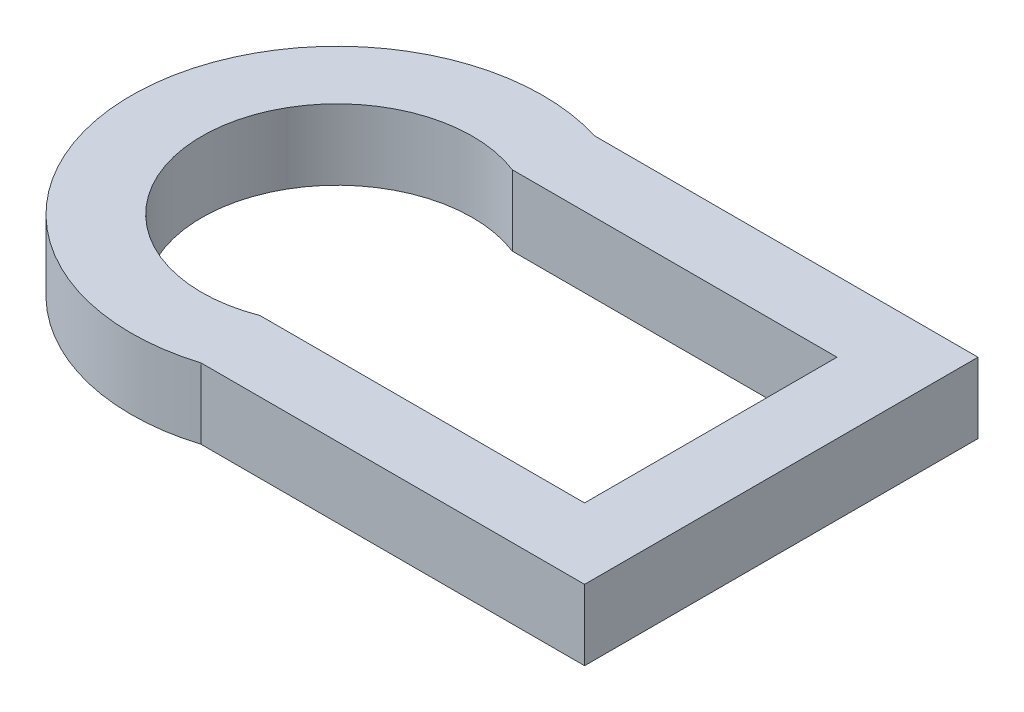
ISO-10303-21;
HEADER;
FILE_DESCRIPTION(('STEP AP214'),'2;1');
FILE_NAME('part.step','',(''),(''),'','','');
FILE_SCHEMA(('AUTOMOTIVE_DESIGN { 1 0 10303 214 1 1 1 1 }'));
ENDSEC;
DATA;
#1=APPLICATION_CONTEXT('core data for automotive mechanical design processes');
#2=APPLICATION_PROTOCOL_DEFINITION('international standard','automotive_design',2000,#1);
#3=PRODUCT_CONTEXT('',#1,'mechanical');
#4=PRODUCT('Part','Part','',(#3));
#5=PRODUCT_RELATED_PRODUCT_CATEGORY('part','',(#4));
#6=PRODUCT_DEFINITION_FORMATION('','',#4);
#7=PRODUCT_DEFINITION_CONTEXT('part definition',#1,'design');
#8=PRODUCT_DEFINITION('design','',#6,#7);
#9=PRODUCT_DEFINITION_SHAPE('','',#8);
#10=(LENGTH_UNIT() NAMED_UNIT(*) SI_UNIT(.MILLI.,.METRE.));
#11=(NAMED_UNIT(*) PLANE_ANGLE_UNIT() SI_UNIT($,.RADIAN.));
#12=(NAMED_UNIT(*) SI_UNIT($,.STERADIAN.) SOLID_ANGLE_UNIT());
#13=UNCERTAINTY_MEASURE_WITH_UNIT(LENGTH_MEASURE(1.E-05),#10,'distance_accuracy_value','');
#14=(GEOMETRIC_REPRESENTATION_CONTEXT(3) GLOBAL_UNCERTAINTY_ASSIGNED_CONTEXT((#13)) GLOBAL_UNIT_ASSIGNED_CONTEXT((#10,
#11,#12)) REPRESENTATION_CONTEXT('',''));
#15=CARTESIAN_POINT('',(0.,0.,0.));
#16=DIRECTION('',(0.,0.,1.));
#17=DIRECTION('',(1.,0.,0.));
#18=AXIS2_PLACEMENT_3D('',#15,#16,#17);
#19=CARTESIAN_POINT('',(0.,5.,0.));
#20=DIRECTION('',(0.,1.,0.));
#21=DIRECTION('',(0.,0.,1.));
#22=AXIS2_PLACEMENT_3D('',#19,#20,#21);
#23=PLANE('',#22);
#24=CARTESIAN_POINT('',(0.,5.,0.));
#25=DIRECTION('',(0.,1.,0.));
#26=DIRECTION('',(0.,0.,1.));
#27=AXIS2_PLACEMENT_3D('',#24,#25,#26);
#28=CIRCLE('',#27,14.6);
#29=CARTESIAN_POINT('',(4.30784168697039,5.,-13.95));
#30=VERTEX_POINT('',#29);
#31=CARTESIAN_POINT('',(4.30784168697039,5.,13.95));
#32=VERTEX_POINT('',#31);
#33=EDGE_CURVE('E137',#30,#32,#28,.T.);
#34=ORIENTED_EDGE('',*,*,#33,.T.);
#35=DIRECTION('',(1.,0.,0.));
#36=VECTOR('',#35,1.);
#37=CARTESIAN_POINT('',(4.30784168697039,5.,13.95));
#38=LINE('',#37,#36);
#39=CARTESIAN_POINT('',(31.5,5.,13.95));
#40=VERTEX_POINT('',#39);
#41=EDGE_CURVE('E140',#32,#40,#38,.T.);
#42=ORIENTED_EDGE('',*,*,#41,.T.);
#43=DIRECTION('',(0.,0.,-1.));
#44=VECTOR('',#43,1.);
#45=CARTESIAN_POINT('',(31.5,5.,13.95));
#46=LINE('',#45,#44);
#47=CARTESIAN_POINT('',(31.5,5.,-13.95));
#48=VERTEX_POINT('',#47);
#49=EDGE_CURVE('E143',#40,#48,#46,.T.);
#50=ORIENTED_EDGE('',*,*,#49,.T.);
#51=DIRECTION('',(-1.,0.,0.));
#52=VECTOR('',#51,1.);
#53=CARTESIAN_POINT('',(4.30784168697039,5.,-13.95));
#54=LINE('',#53,#52);
#55=EDGE_CURVE('E145',#48,#30,#54,.T.);
#56=ORIENTED_EDGE('',*,*,#55,.T.);
#57=EDGE_LOOP('',(#34,#42,#50,#56));
#58=FACE_BOUND('',#57,.T.);
#59=DIRECTION('',(1.,0.,0.));
#60=VECTOR('',#59,1.);
#61=CARTESIAN_POINT('',(3.47239110700393,5.,8.95));
#62=LINE('',#61,#60);
#63=CARTESIAN_POINT('',(3.47239110700393,5.,8.95));
#64=VERTEX_POINT('',#63);
#65=CARTESIAN_POINT('',(26.5,5.,8.95));
#66=VERTEX_POINT('',#65);
#67=EDGE_CURVE('E109',#64,#66,#62,.T.);
#68=ORIENTED_EDGE('',*,*,#67,.F.);
#69=CARTESIAN_POINT('',(0.,5.,0.));
#70=DIRECTION('',(0.,1.,0.));
#71=DIRECTION('',(0.,0.,1.));
#72=AXIS2_PLACEMENT_3D('',#69,#70,#71);
#73=CIRCLE('',#72,9.6);
#74=CARTESIAN_POINT('',(3.47239110700393,5.,-8.95));
#75=VERTEX_POINT('',#74);
#76=EDGE_CURVE('E101',#75,#64,#73,.T.);
#77=ORIENTED_EDGE('',*,*,#76,.F.);
#78=DIRECTION('',(-1.,0.,0.));
#79=VECTOR('',#78,1.);
#80=CARTESIAN_POINT('',(3.47239110700393,5.,-8.95));
#81=LINE('',#80,#79);
#82=CARTESIAN_POINT('',(26.5,5.,-8.95));
#83=VERTEX_POINT('',#82);
#84=EDGE_CURVE('E123',#83,#75,#81,.T.);
#85=ORIENTED_EDGE('',*,*,#84,.F.);
#86=DIRECTION('',(0.,0.,-1.));
#87=VECTOR('',#86,1.);
#88=CARTESIAN_POINT('',(26.5,5.,8.95));
#89=LINE('',#88,#87);
#90=EDGE_CURVE('E121',#66,#83,#89,.T.);
#91=ORIENTED_EDGE('',*,*,#90,.F.);
#92=EDGE_LOOP('',(#68,#77,#85,#91));
#93=FACE_BOUND('',#92,.T.);
#94=ADVANCED_FACE('F36',(#58,#93),#23,.T.);
#95=CARTESIAN_POINT('',(0.,0.,0.));
#96=DIRECTION('',(0.,1.,0.));
#97=DIRECTION('',(0.,0.,1.));
#98=AXIS2_PLACEMENT_3D('',#95,#96,#97);
#99=PLANE('',#98);
#100=CARTESIAN_POINT('',(0.,0.,0.));
#101=DIRECTION('',(0.,1.,0.));
#102=DIRECTION('',(0.,0.,1.));
#103=AXIS2_PLACEMENT_3D('',#100,#101,#102);
#104=CIRCLE('',#103,14.6);
#105=CARTESIAN_POINT('',(4.30784168697039,0.,-13.95));
#106=VERTEX_POINT('',#105);
#107=CARTESIAN_POINT('',(4.30784168697039,0.,13.95));
#108=VERTEX_POINT('',#107);
#109=EDGE_CURVE('E117',#106,#108,#104,.T.);
#110=ORIENTED_EDGE('',*,*,#109,.F.);
#111=DIRECTION('',(-1.,0.,0.));
#112=VECTOR('',#111,1.);
#113=CARTESIAN_POINT('',(4.30784168697039,0.,-13.95));
#114=LINE('',#113,#112);
#115=CARTESIAN_POINT('',(31.5,0.,-13.95));
#116=VERTEX_POINT('',#115);
#117=EDGE_CURVE('E141',#116,#106,#114,.T.);
#118=ORIENTED_EDGE('',*,*,#117,.F.);
#119=DIRECTION('',(0.,0.,-1.));
#120=VECTOR('',#119,1.);
#121=CARTESIAN_POINT('',(31.5,0.,13.95));
#122=LINE('',#121,#120);
#123=CARTESIAN_POINT('',(31.5,0.,13.95));
#124=VERTEX_POINT('',#123);
#125=EDGE_CURVE('E152',#124,#116,#122,.T.);
#126=ORIENTED_EDGE('',*,*,#125,.F.);
#127=DIRECTION('',(1.,0.,0.));
#128=VECTOR('',#127,1.);
#129=CARTESIAN_POINT('',(4.30784168697039,0.,13.95));
#130=LINE('',#129,#128);
#131=EDGE_CURVE('E150',#108,#124,#130,.T.);
#132=ORIENTED_EDGE('',*,*,#131,.F.);
#133=EDGE_LOOP('',(#110,#118,#126,#132));
#134=FACE_BOUND('',#133,.T.);
#135=CARTESIAN_POINT('',(0.,0.,0.));
#136=DIRECTION('',(0.,1.,0.));
#137=DIRECTION('',(0.,0.,1.));
#138=AXIS2_PLACEMENT_3D('',#135,#136,#137);
#139=CIRCLE('',#138,9.6);
#140=CARTESIAN_POINT('',(3.47239110700393,0.,-8.95));
#141=VERTEX_POINT('',#140);
#142=CARTESIAN_POINT('',(3.47239110700393,0.,8.95));
#143=VERTEX_POINT('',#142);
#144=EDGE_CURVE('E59',#141,#143,#139,.T.);
#145=ORIENTED_EDGE('',*,*,#144,.T.);
#146=DIRECTION('',(1.,0.,0.));
#147=VECTOR('',#146,1.);
#148=CARTESIAN_POINT('',(3.47239110700393,0.,8.95));
#149=LINE('',#148,#147);
#150=CARTESIAN_POINT('',(26.5,0.,8.95));
#151=VERTEX_POINT('',#150);
#152=EDGE_CURVE('E116',#143,#151,#149,.T.);
#153=ORIENTED_EDGE('',*,*,#152,.T.);
#154=DIRECTION('',(0.,0.,-1.));
#155=VECTOR('',#154,1.);
#156=CARTESIAN_POINT('',(26.5,0.,8.95));
#157=LINE('',#156,#155);
#158=CARTESIAN_POINT('',(26.5,0.,-8.95));
#159=VERTEX_POINT('',#158);
#160=EDGE_CURVE('E129',#151,#159,#157,.T.);
#161=ORIENTED_EDGE('',*,*,#160,.T.);
#162=DIRECTION('',(-1.,0.,0.));
#163=VECTOR('',#162,1.);
#164=CARTESIAN_POINT('',(3.47239110700393,0.,-8.95));
#165=LINE('',#164,#163);
#166=EDGE_CURVE('E110',#159,#141,#165,.T.);
#167=ORIENTED_EDGE('',*,*,#166,.T.);
#168=EDGE_LOOP('',(#145,#153,#161,#167));
#169=FACE_BOUND('',#168,.T.);
#170=ADVANCED_FACE('F170',(#134,#169),#99,.F.);
#171=CARTESIAN_POINT('',(0.,5.,0.));
#172=DIRECTION('',(0.,-1.,0.));
#173=DIRECTION('',(0.,0.,-1.));
#174=AXIS2_PLACEMENT_3D('',#171,#172,#173);
#175=CYLINDRICAL_SURFACE('',#174,14.6);
#176=ORIENTED_EDGE('',*,*,#109,.T.);
#177=DIRECTION('',(0.,-1.,0.));
#178=VECTOR('',#177,1.);
#179=CARTESIAN_POINT('',(4.30784168697039,5.,13.95));
#180=LINE('',#179,#178);
#181=EDGE_CURVE('E11',#32,#108,#180,.T.);
#182=ORIENTED_EDGE('',*,*,#181,.F.);
#183=ORIENTED_EDGE('',*,*,#33,.F.);
#184=DIRECTION('',(0.,-1.,0.));
#185=VECTOR('',#184,1.);
#186=CARTESIAN_POINT('',(4.30784168697039,5.,-13.95));
#187=LINE('',#186,#185);
#188=EDGE_CURVE('E147',#30,#106,#187,.T.);
#189=ORIENTED_EDGE('',*,*,#188,.T.);
#190=EDGE_LOOP('',(#176,#182,#183,#189));
#191=FACE_BOUND('',#190,.T.);
#192=ADVANCED_FACE('F38',(#191),#175,.T.);
#193=CARTESIAN_POINT('',(4.30784168697039,5.,13.95));
#194=DIRECTION('',(0.,0.,-1.));
#195=DIRECTION('',(-1.,0.,0.));
#196=AXIS2_PLACEMENT_3D('',#193,#194,#195);
#197=PLANE('',#196);
#198=ORIENTED_EDGE('',*,*,#131,.T.);
#199=DIRECTION('',(0.,-1.,0.));
#200=VECTOR('',#199,1.);
#201=CARTESIAN_POINT('',(31.5,5.,13.95));
#202=LINE('',#201,#200);
#203=EDGE_CURVE('E44',#40,#124,#202,.T.);
#204=ORIENTED_EDGE('',*,*,#203,.F.);
#205=ORIENTED_EDGE('',*,*,#41,.F.);
#206=ORIENTED_EDGE('',*,*,#181,.T.);
#207=EDGE_LOOP('',(#198,#204,#205,#206));
#208=FACE_BOUND('',#207,.T.);
#209=ADVANCED_FACE('F180',(#208),#197,.F.);
#210=CARTESIAN_POINT('',(31.5,5.,13.95));
#211=DIRECTION('',(-1.,0.,0.));
#212=DIRECTION('',(0.,0.,1.));
#213=AXIS2_PLACEMENT_3D('',#210,#211,#212);
#214=PLANE('',#213);
#215=ORIENTED_EDGE('',*,*,#125,.T.);
#216=DIRECTION('',(0.,-1.,0.));
#217=VECTOR('',#216,1.);
#218=CARTESIAN_POINT('',(31.5,5.,-13.95));
#219=LINE('',#218,#217);
#220=EDGE_CURVE('E157',#48,#116,#219,.T.);
#221=ORIENTED_EDGE('',*,*,#220,.F.);
#222=ORIENTED_EDGE('',*,*,#49,.F.);
#223=ORIENTED_EDGE('',*,*,#203,.T.);
#224=EDGE_LOOP('',(#215,#221,#222,#223));
#225=FACE_BOUND('',#224,.T.);
#226=ADVANCED_FACE('F164',(#225),#214,.F.);
#227=CARTESIAN_POINT('',(4.30784168697039,5.,-13.95));
#228=DIRECTION('',(0.,0.,1.));
#229=DIRECTION('',(1.,0.,0.));
#230=AXIS2_PLACEMENT_3D('',#227,#228,#229);
#231=PLANE('',#230);
#232=ORIENTED_EDGE('',*,*,#117,.T.);
#233=ORIENTED_EDGE('',*,*,#188,.F.);
#234=ORIENTED_EDGE('',*,*,#55,.F.);
#235=ORIENTED_EDGE('',*,*,#220,.T.);
#236=EDGE_LOOP('',(#232,#233,#234,#235));
#237=FACE_BOUND('',#236,.T.);
#238=ADVANCED_FACE('F174',(#237),#231,.F.);
#239=CARTESIAN_POINT('',(0.,5.,0.));
#240=DIRECTION('',(0.,-1.,0.));
#241=DIRECTION('',(0.,0.,-1.));
#242=AXIS2_PLACEMENT_3D('',#239,#240,#241);
#243=CYLINDRICAL_SURFACE('',#242,9.6);
#244=ORIENTED_EDGE('',*,*,#144,.F.);
#245=DIRECTION('',(0.,-1.,0.));
#246=VECTOR('',#245,1.);
#247=CARTESIAN_POINT('',(3.47239110700393,5.,-8.95));
#248=LINE('',#247,#246);
#249=EDGE_CURVE('E105',#75,#141,#248,.T.);
#250=ORIENTED_EDGE('',*,*,#249,.F.);
#251=ORIENTED_EDGE('',*,*,#76,.T.);
#252=DIRECTION('',(0.,-1.,0.));
#253=VECTOR('',#252,1.);
#254=CARTESIAN_POINT('',(3.47239110700393,5.,8.95));
#255=LINE('',#254,#253);
#256=EDGE_CURVE('E104',#64,#143,#255,.T.);
#257=ORIENTED_EDGE('',*,*,#256,.T.);
#258=EDGE_LOOP('',(#244,#250,#251,#257));
#259=FACE_BOUND('',#258,.T.);
#260=ADVANCED_FACE('F103',(#259),#243,.F.);
#261=CARTESIAN_POINT('',(3.47239110700393,5.,8.95));
#262=DIRECTION('',(0.,0.,-1.));
#263=DIRECTION('',(-1.,0.,0.));
#264=AXIS2_PLACEMENT_3D('',#261,#262,#263);
#265=PLANE('',#264);
#266=ORIENTED_EDGE('',*,*,#152,.F.);
#267=ORIENTED_EDGE('',*,*,#256,.F.);
#268=ORIENTED_EDGE('',*,*,#67,.T.);
#269=DIRECTION('',(0.,-1.,0.));
#270=VECTOR('',#269,1.);
#271=CARTESIAN_POINT('',(26.5,5.,8.95));
#272=LINE('',#271,#270);
#273=EDGE_CURVE('E118',#66,#151,#272,.T.);
#274=ORIENTED_EDGE('',*,*,#273,.T.);
#275=EDGE_LOOP('',(#266,#267,#268,#274));
#276=FACE_BOUND('',#275,.T.);
#277=ADVANCED_FACE('F113',(#276),#265,.T.);
#278=CARTESIAN_POINT('',(26.5,5.,8.95));
#279=DIRECTION('',(-1.,0.,0.));
#280=DIRECTION('',(0.,0.,1.));
#281=AXIS2_PLACEMENT_3D('',#278,#279,#280);
#282=PLANE('',#281);
#283=ORIENTED_EDGE('',*,*,#160,.F.);
#284=ORIENTED_EDGE('',*,*,#273,.F.);
#285=ORIENTED_EDGE('',*,*,#90,.T.);
#286=DIRECTION('',(0.,-1.,0.));
#287=VECTOR('',#286,1.);
#288=CARTESIAN_POINT('',(26.5,5.,-8.95));
#289=LINE('',#288,#287);
#290=EDGE_CURVE('E51',#83,#159,#289,.T.);
#291=ORIENTED_EDGE('',*,*,#290,.T.);
#292=EDGE_LOOP('',(#283,#284,#285,#291));
#293=FACE_BOUND('',#292,.T.);
#294=ADVANCED_FACE('F203',(#293),#282,.T.);
#295=CARTESIAN_POINT('',(3.47239110700393,5.,-8.95));
#296=DIRECTION('',(0.,0.,1.));
#297=DIRECTION('',(1.,0.,0.));
#298=AXIS2_PLACEMENT_3D('',#295,#296,#297);
#299=PLANE('',#298);
#300=ORIENTED_EDGE('',*,*,#166,.F.);
#301=ORIENTED_EDGE('',*,*,#290,.F.);
#302=ORIENTED_EDGE('',*,*,#84,.T.);
#303=ORIENTED_EDGE('',*,*,#249,.T.);
#304=EDGE_LOOP('',(#300,#301,#302,#303));
#305=FACE_BOUND('',#304,.T.);
#306=ADVANCED_FACE('F207',(#305),#299,.T.);
#307=CLOSED_SHELL('',(#94,#170,#192,#209,#226,#238,#260,#277,#294,#306));
#308=MANIFOLD_SOLID_BREP('B2',#307);
#309=ADVANCED_BREP_SHAPE_REPRESENTATION('',(#18,#308),#14);
#310=SHAPE_DEFINITION_REPRESENTATION(#9,#309);
ENDSEC;
END-ISO-10303-21;
